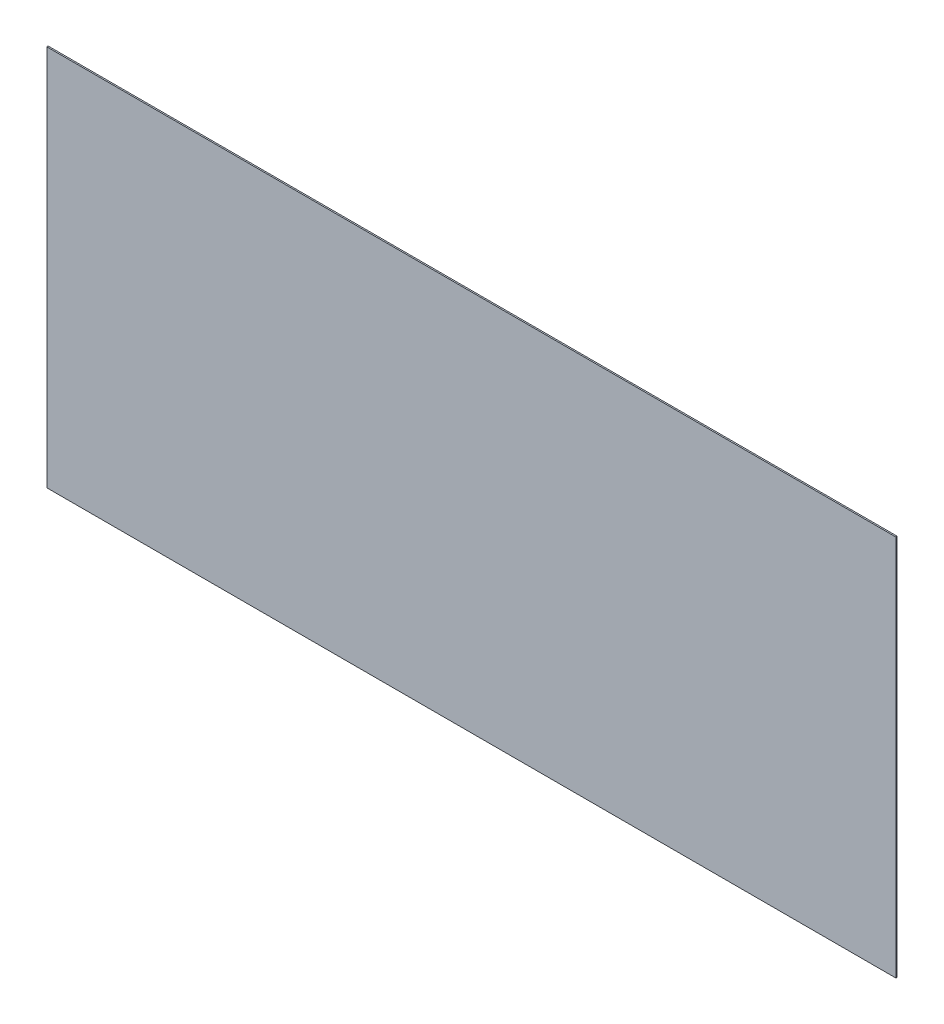
ISO-10303-21;
HEADER;
FILE_DESCRIPTION(('STEP AP214'),'2;1');
FILE_NAME('part.step','',(''),(''),'','','');
FILE_SCHEMA(('AUTOMOTIVE_DESIGN { 1 0 10303 214 1 1 1 1 }'));
ENDSEC;
DATA;
#1=APPLICATION_CONTEXT('core data for automotive mechanical design processes');
#2=APPLICATION_PROTOCOL_DEFINITION('international standard','automotive_design',2000,#1);
#3=PRODUCT_CONTEXT('',#1,'mechanical');
#4=PRODUCT('Part','Part','',(#3));
#5=PRODUCT_RELATED_PRODUCT_CATEGORY('part','',(#4));
#6=PRODUCT_DEFINITION_FORMATION('','',#4);
#7=PRODUCT_DEFINITION_CONTEXT('part definition',#1,'design');
#8=PRODUCT_DEFINITION('design','',#6,#7);
#9=PRODUCT_DEFINITION_SHAPE('','',#8);
#10=(LENGTH_UNIT() NAMED_UNIT(*) SI_UNIT(.MILLI.,.METRE.));
#11=(NAMED_UNIT(*) PLANE_ANGLE_UNIT() SI_UNIT($,.RADIAN.));
#12=(NAMED_UNIT(*) SI_UNIT($,.STERADIAN.) SOLID_ANGLE_UNIT());
#13=UNCERTAINTY_MEASURE_WITH_UNIT(LENGTH_MEASURE(1.E-05),#10,'distance_accuracy_value','');
#14=(GEOMETRIC_REPRESENTATION_CONTEXT(3) GLOBAL_UNCERTAINTY_ASSIGNED_CONTEXT((#13)) GLOBAL_UNIT_ASSIGNED_CONTEXT((#10,
#11,#12)) REPRESENTATION_CONTEXT('',''));
#15=CARTESIAN_POINT('',(0.,0.,0.));
#16=DIRECTION('',(0.,0.,1.));
#17=DIRECTION('',(1.,0.,0.));
#18=AXIS2_PLACEMENT_3D('',#15,#16,#17);
#19=CARTESIAN_POINT('',(69.,406.,1.));
#20=DIRECTION('',(1.,0.,0.));
#21=DIRECTION('',(0.,0.,-1.));
#22=AXIS2_PLACEMENT_3D('',#19,#20,#21);
#23=PLANE('',#22);
#24=DIRECTION('',(0.,-1.,0.));
#25=VECTOR('',#24,1.);
#26=CARTESIAN_POINT('',(69.,406.,0.));
#27=LINE('',#26,#25);
#28=CARTESIAN_POINT('',(69.,684.,0.));
#29=VERTEX_POINT('',#28);
#30=CARTESIAN_POINT('',(69.,406.,0.));
#31=VERTEX_POINT('',#30);
#32=EDGE_CURVE('E102',#29,#31,#27,.T.);
#33=ORIENTED_EDGE('',*,*,#32,.T.);
#34=DIRECTION('',(0.,0.,-1.));
#35=VECTOR('',#34,1.);
#36=CARTESIAN_POINT('',(69.,406.,1.));
#37=LINE('',#36,#35);
#38=CARTESIAN_POINT('',(69.,406.,1.));
#39=VERTEX_POINT('',#38);
#40=EDGE_CURVE('E11',#39,#31,#37,.T.);
#41=ORIENTED_EDGE('',*,*,#40,.F.);
#42=DIRECTION('',(0.,-1.,0.));
#43=VECTOR('',#42,1.);
#44=CARTESIAN_POINT('',(69.,406.,1.));
#45=LINE('',#44,#43);
#46=CARTESIAN_POINT('',(69.,684.,1.));
#47=VERTEX_POINT('',#46);
#48=EDGE_CURVE('E90',#47,#39,#45,.T.);
#49=ORIENTED_EDGE('',*,*,#48,.F.);
#50=DIRECTION('',(0.,0.,-1.));
#51=VECTOR('',#50,1.);
#52=CARTESIAN_POINT('',(69.,684.,1.));
#53=LINE('',#52,#51);
#54=EDGE_CURVE('E98',#47,#29,#53,.T.);
#55=ORIENTED_EDGE('',*,*,#54,.T.);
#56=EDGE_LOOP('',(#33,#41,#49,#55));
#57=FACE_BOUND('',#56,.T.);
#58=ADVANCED_FACE('F39',(#57),#23,.F.);
#59=CARTESIAN_POINT('',(69.,406.,1.));
#60=DIRECTION('',(0.,1.,0.));
#61=DIRECTION('',(0.,0.,1.));
#62=AXIS2_PLACEMENT_3D('',#59,#60,#61);
#63=PLANE('',#62);
#64=DIRECTION('',(1.,0.,0.));
#65=VECTOR('',#64,1.);
#66=CARTESIAN_POINT('',(69.,406.,0.));
#67=LINE('',#66,#65);
#68=CARTESIAN_POINT('',(687.,406.,0.));
#69=VERTEX_POINT('',#68);
#70=EDGE_CURVE('E94',#31,#69,#67,.T.);
#71=ORIENTED_EDGE('',*,*,#70,.T.);
#72=DIRECTION('',(0.,0.,-1.));
#73=VECTOR('',#72,1.);
#74=CARTESIAN_POINT('',(687.,406.,1.));
#75=LINE('',#74,#73);
#76=CARTESIAN_POINT('',(687.,406.,1.));
#77=VERTEX_POINT('',#76);
#78=EDGE_CURVE('E47',#77,#69,#75,.T.);
#79=ORIENTED_EDGE('',*,*,#78,.F.);
#80=DIRECTION('',(1.,0.,0.));
#81=VECTOR('',#80,1.);
#82=CARTESIAN_POINT('',(69.,406.,1.));
#83=LINE('',#82,#81);
#84=EDGE_CURVE('E85',#39,#77,#83,.T.);
#85=ORIENTED_EDGE('',*,*,#84,.F.);
#86=ORIENTED_EDGE('',*,*,#40,.T.);
#87=EDGE_LOOP('',(#71,#79,#85,#86));
#88=FACE_BOUND('',#87,.T.);
#89=ADVANCED_FACE('F93',(#88),#63,.F.);
#90=CARTESIAN_POINT('',(687.,406.,1.));
#91=DIRECTION('',(-1.,0.,0.));
#92=DIRECTION('',(0.,0.,1.));
#93=AXIS2_PLACEMENT_3D('',#90,#91,#92);
#94=PLANE('',#93);
#95=DIRECTION('',(0.,1.,0.));
#96=VECTOR('',#95,1.);
#97=CARTESIAN_POINT('',(687.,406.,0.));
#98=LINE('',#97,#96);
#99=CARTESIAN_POINT('',(687.,684.,0.));
#100=VERTEX_POINT('',#99);
#101=EDGE_CURVE('E72',#69,#100,#98,.T.);
#102=ORIENTED_EDGE('',*,*,#101,.T.);
#103=DIRECTION('',(0.,0.,-1.));
#104=VECTOR('',#103,1.);
#105=CARTESIAN_POINT('',(687.,684.,1.));
#106=LINE('',#105,#104);
#107=CARTESIAN_POINT('',(687.,684.,1.));
#108=VERTEX_POINT('',#107);
#109=EDGE_CURVE('E95',#108,#100,#106,.T.);
#110=ORIENTED_EDGE('',*,*,#109,.F.);
#111=DIRECTION('',(0.,1.,0.));
#112=VECTOR('',#111,1.);
#113=CARTESIAN_POINT('',(687.,406.,1.));
#114=LINE('',#113,#112);
#115=EDGE_CURVE('E88',#77,#108,#114,.T.);
#116=ORIENTED_EDGE('',*,*,#115,.F.);
#117=ORIENTED_EDGE('',*,*,#78,.T.);
#118=EDGE_LOOP('',(#102,#110,#116,#117));
#119=FACE_BOUND('',#118,.T.);
#120=ADVANCED_FACE('F96',(#119),#94,.F.);
#121=CARTESIAN_POINT('',(69.,684.,1.));
#122=DIRECTION('',(0.,-1.,0.));
#123=DIRECTION('',(0.,0.,-1.));
#124=AXIS2_PLACEMENT_3D('',#121,#122,#123);
#125=PLANE('',#124);
#126=DIRECTION('',(-1.,0.,0.));
#127=VECTOR('',#126,1.);
#128=CARTESIAN_POINT('',(69.,684.,0.));
#129=LINE('',#128,#127);
#130=EDGE_CURVE('E78',#100,#29,#129,.T.);
#131=ORIENTED_EDGE('',*,*,#130,.T.);
#132=ORIENTED_EDGE('',*,*,#54,.F.);
#133=DIRECTION('',(-1.,0.,0.));
#134=VECTOR('',#133,1.);
#135=CARTESIAN_POINT('',(69.,684.,1.));
#136=LINE('',#135,#134);
#137=EDGE_CURVE('E55',#108,#47,#136,.T.);
#138=ORIENTED_EDGE('',*,*,#137,.F.);
#139=ORIENTED_EDGE('',*,*,#109,.T.);
#140=EDGE_LOOP('',(#131,#132,#138,#139));
#141=FACE_BOUND('',#140,.T.);
#142=ADVANCED_FACE('F109',(#141),#125,.F.);
#143=CARTESIAN_POINT('',(0.,0.,1.));
#144=DIRECTION('',(0.,0.,-1.));
#145=DIRECTION('',(-1.,0.,0.));
#146=AXIS2_PLACEMENT_3D('',#143,#144,#145);
#147=PLANE('',#146);
#148=ORIENTED_EDGE('',*,*,#48,.T.);
#149=ORIENTED_EDGE('',*,*,#84,.T.);
#150=ORIENTED_EDGE('',*,*,#115,.T.);
#151=ORIENTED_EDGE('',*,*,#137,.T.);
#152=EDGE_LOOP('',(#148,#149,#150,#151));
#153=FACE_BOUND('',#152,.T.);
#154=ADVANCED_FACE('F86',(#153),#147,.F.);
#155=CARTESIAN_POINT('',(0.,0.,0.));
#156=DIRECTION('',(0.,0.,-1.));
#157=DIRECTION('',(-1.,0.,0.));
#158=AXIS2_PLACEMENT_3D('',#155,#156,#157);
#159=PLANE('',#158);
#160=ORIENTED_EDGE('',*,*,#32,.F.);
#161=ORIENTED_EDGE('',*,*,#130,.F.);
#162=ORIENTED_EDGE('',*,*,#101,.F.);
#163=ORIENTED_EDGE('',*,*,#70,.F.);
#164=EDGE_LOOP('',(#160,#161,#162,#163));
#165=FACE_BOUND('',#164,.T.);
#166=ADVANCED_FACE('F112',(#165),#159,.T.);
#167=CLOSED_SHELL('',(#58,#89,#120,#142,#154,#166));
#168=MANIFOLD_SOLID_BREP('B2',#167);
#169=ADVANCED_BREP_SHAPE_REPRESENTATION('',(#18,#168),#14);
#170=SHAPE_DEFINITION_REPRESENTATION(#9,#169);
ENDSEC;
END-ISO-10303-21;
